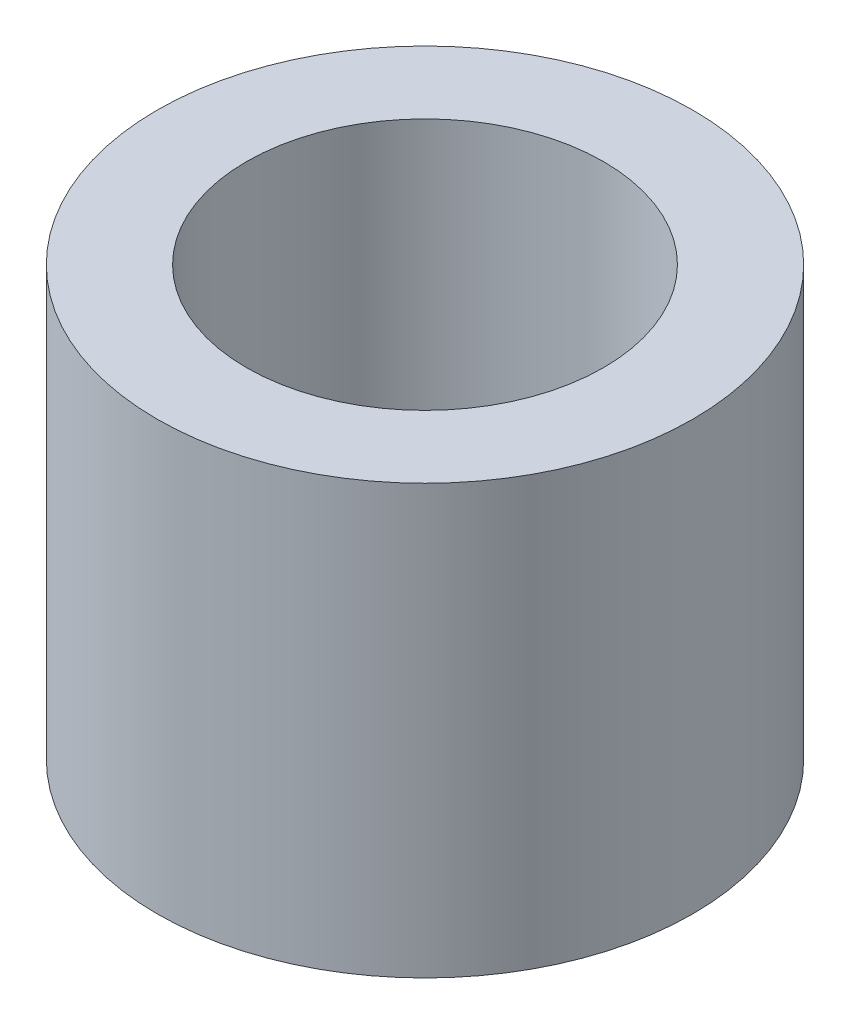
ISO-10303-21;
HEADER;
FILE_DESCRIPTION(('STEP AP214'),'2;1');
FILE_NAME('part.step','',(''),(''),'','','');
FILE_SCHEMA(('AUTOMOTIVE_DESIGN { 1 0 10303 214 1 1 1 1 }'));
ENDSEC;
DATA;
#1=APPLICATION_CONTEXT('core data for automotive mechanical design processes');
#2=APPLICATION_PROTOCOL_DEFINITION('international standard','automotive_design',2000,#1);
#3=PRODUCT_CONTEXT('',#1,'mechanical');
#4=PRODUCT('Part','Part','',(#3));
#5=PRODUCT_RELATED_PRODUCT_CATEGORY('part','',(#4));
#6=PRODUCT_DEFINITION_FORMATION('','',#4);
#7=PRODUCT_DEFINITION_CONTEXT('part definition',#1,'design');
#8=PRODUCT_DEFINITION('design','',#6,#7);
#9=PRODUCT_DEFINITION_SHAPE('','',#8);
#10=(LENGTH_UNIT() NAMED_UNIT(*) SI_UNIT(.MILLI.,.METRE.));
#11=(NAMED_UNIT(*) PLANE_ANGLE_UNIT() SI_UNIT($,.RADIAN.));
#12=(NAMED_UNIT(*) SI_UNIT($,.STERADIAN.) SOLID_ANGLE_UNIT());
#13=UNCERTAINTY_MEASURE_WITH_UNIT(LENGTH_MEASURE(1.E-05),#10,'distance_accuracy_value','');
#14=(GEOMETRIC_REPRESENTATION_CONTEXT(3) GLOBAL_UNCERTAINTY_ASSIGNED_CONTEXT((#13)) GLOBAL_UNIT_ASSIGNED_CONTEXT((#10,
#11,#12)) REPRESENTATION_CONTEXT('',''));
#15=CARTESIAN_POINT('',(0.,0.,0.));
#16=DIRECTION('',(0.,0.,1.));
#17=DIRECTION('',(1.,0.,0.));
#18=AXIS2_PLACEMENT_3D('',#15,#16,#17);
#19=CARTESIAN_POINT('',(0.,12.,0.));
#20=DIRECTION('',(0.,1.,0.));
#21=DIRECTION('',(0.,0.,1.));
#22=AXIS2_PLACEMENT_3D('',#19,#20,#21);
#23=PLANE('',#22);
#24=CARTESIAN_POINT('',(0.,12.,0.));
#25=DIRECTION('',(0.,1.,0.));
#26=DIRECTION('',(0.,0.,1.));
#27=AXIS2_PLACEMENT_3D('',#24,#25,#26);
#28=CIRCLE('',#27,7.5);
#29=CARTESIAN_POINT('',(0.,12.,7.5));
#30=VERTEX_POINT('',#29);
#31=EDGE_CURVE('E10',#30,#30,#28,.T.);
#32=ORIENTED_EDGE('',*,*,#31,.T.);
#33=EDGE_LOOP('',(#32));
#34=FACE_BOUND('',#33,.T.);
#35=CARTESIAN_POINT('',(0.,12.,0.));
#36=DIRECTION('',(0.,1.,0.));
#37=DIRECTION('',(0.,0.,1.));
#38=AXIS2_PLACEMENT_3D('',#35,#36,#37);
#39=CIRCLE('',#38,5.);
#40=CARTESIAN_POINT('',(0.,12.,5.));
#41=VERTEX_POINT('',#40);
#42=EDGE_CURVE('E55',#41,#41,#39,.T.);
#43=ORIENTED_EDGE('',*,*,#42,.F.);
#44=EDGE_LOOP('',(#43));
#45=FACE_BOUND('',#44,.T.);
#46=ADVANCED_FACE('F41',(#34,#45),#23,.T.);
#47=CARTESIAN_POINT('',(0.,0.,0.));
#48=DIRECTION('',(0.,1.,0.));
#49=DIRECTION('',(0.,0.,1.));
#50=AXIS2_PLACEMENT_3D('',#47,#48,#49);
#51=PLANE('',#50);
#52=CARTESIAN_POINT('',(0.,0.,0.));
#53=DIRECTION('',(0.,1.,0.));
#54=DIRECTION('',(0.,0.,1.));
#55=AXIS2_PLACEMENT_3D('',#52,#53,#54);
#56=CIRCLE('',#55,7.5);
#57=CARTESIAN_POINT('',(0.,0.,7.5));
#58=VERTEX_POINT('',#57);
#59=EDGE_CURVE('E45',#58,#58,#56,.T.);
#60=ORIENTED_EDGE('',*,*,#59,.F.);
#61=EDGE_LOOP('',(#60));
#62=FACE_BOUND('',#61,.T.);
#63=CARTESIAN_POINT('',(0.,0.,0.));
#64=DIRECTION('',(0.,1.,0.));
#65=DIRECTION('',(0.,0.,1.));
#66=AXIS2_PLACEMENT_3D('',#63,#64,#65);
#67=CIRCLE('',#66,5.);
#68=CARTESIAN_POINT('',(0.,0.,5.));
#69=VERTEX_POINT('',#68);
#70=EDGE_CURVE('E57',#69,#69,#67,.T.);
#71=ORIENTED_EDGE('',*,*,#70,.T.);
#72=EDGE_LOOP('',(#71));
#73=FACE_BOUND('',#72,.T.);
#74=ADVANCED_FACE('F68',(#62,#73),#51,.F.);
#75=CARTESIAN_POINT('',(0.,12.,0.));
#76=DIRECTION('',(0.,-1.,0.));
#77=DIRECTION('',(0.,0.,-1.));
#78=AXIS2_PLACEMENT_3D('',#75,#76,#77);
#79=CYLINDRICAL_SURFACE('',#78,7.5);
#80=ORIENTED_EDGE('',*,*,#31,.F.);
#81=EDGE_LOOP('',(#80));
#82=FACE_BOUND('',#81,.T.);
#83=ORIENTED_EDGE('',*,*,#59,.T.);
#84=EDGE_LOOP('',(#83));
#85=FACE_BOUND('',#84,.T.);
#86=ADVANCED_FACE('F43',(#82,#85),#79,.T.);
#87=CARTESIAN_POINT('',(0.,12.,0.));
#88=DIRECTION('',(0.,-1.,0.));
#89=DIRECTION('',(0.,0.,-1.));
#90=AXIS2_PLACEMENT_3D('',#87,#88,#89);
#91=CYLINDRICAL_SURFACE('',#90,5.);
#92=ORIENTED_EDGE('',*,*,#42,.T.);
#93=EDGE_LOOP('',(#92));
#94=FACE_BOUND('',#93,.T.);
#95=ORIENTED_EDGE('',*,*,#70,.F.);
#96=EDGE_LOOP('',(#95));
#97=FACE_BOUND('',#96,.T.);
#98=ADVANCED_FACE('F64',(#94,#97),#91,.F.);
#99=CLOSED_SHELL('',(#46,#74,#86,#98));
#100=MANIFOLD_SOLID_BREP('B2',#99);
#101=ADVANCED_BREP_SHAPE_REPRESENTATION('',(#18,#100),#14);
#102=SHAPE_DEFINITION_REPRESENTATION(#9,#101);
ENDSEC;
END-ISO-10303-21;
